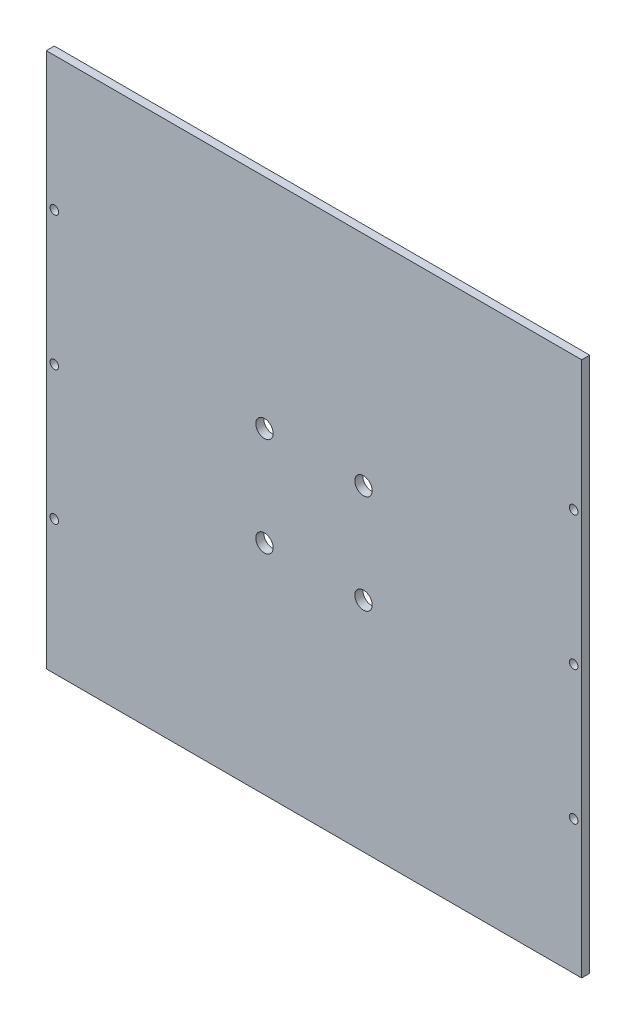
ISO-10303-21;
HEADER;
FILE_DESCRIPTION(('STEP AP214'),'2;1');
FILE_NAME('part.step','',(''),(''),'','','');
FILE_SCHEMA(('AUTOMOTIVE_DESIGN { 1 0 10303 214 1 1 1 1 }'));
ENDSEC;
DATA;
#1=APPLICATION_CONTEXT('core data for automotive mechanical design processes');
#2=APPLICATION_PROTOCOL_DEFINITION('international standard','automotive_design',2000,#1);
#3=PRODUCT_CONTEXT('',#1,'mechanical');
#4=PRODUCT('Part','Part','',(#3));
#5=PRODUCT_RELATED_PRODUCT_CATEGORY('part','',(#4));
#6=PRODUCT_DEFINITION_FORMATION('','',#4);
#7=PRODUCT_DEFINITION_CONTEXT('part definition',#1,'design');
#8=PRODUCT_DEFINITION('design','',#6,#7);
#9=PRODUCT_DEFINITION_SHAPE('','',#8);
#10=(LENGTH_UNIT() NAMED_UNIT(*) SI_UNIT(.MILLI.,.METRE.));
#11=(NAMED_UNIT(*) PLANE_ANGLE_UNIT() SI_UNIT($,.RADIAN.));
#12=(NAMED_UNIT(*) SI_UNIT($,.STERADIAN.) SOLID_ANGLE_UNIT());
#13=UNCERTAINTY_MEASURE_WITH_UNIT(LENGTH_MEASURE(1.E-05),#10,'distance_accuracy_value','');
#14=(GEOMETRIC_REPRESENTATION_CONTEXT(3) GLOBAL_UNCERTAINTY_ASSIGNED_CONTEXT((#13)) GLOBAL_UNIT_ASSIGNED_CONTEXT((#10,
#11,#12)) REPRESENTATION_CONTEXT('',''));
#15=CARTESIAN_POINT('',(0.,0.,0.));
#16=DIRECTION('',(0.,0.,1.));
#17=DIRECTION('',(1.,0.,0.));
#18=AXIS2_PLACEMENT_3D('',#15,#16,#17);
#19=CARTESIAN_POINT('',(0.,0.,3.));
#20=DIRECTION('',(0.,0.,1.));
#21=DIRECTION('',(1.,0.,0.));
#22=AXIS2_PLACEMENT_3D('',#19,#20,#21);
#23=PLANE('',#22);
#24=CARTESIAN_POINT('',(-97.,-50.,3.));
#25=DIRECTION('',(0.,0.,1.));
#26=DIRECTION('',(-1.,0.,0.));
#27=AXIS2_PLACEMENT_3D('',#24,#25,#26);
#28=CIRCLE('',#27,1.60000000000001);
#29=CARTESIAN_POINT('',(-98.6,-50.,3.));
#30=VERTEX_POINT('',#29);
#31=EDGE_CURVE('E196',#30,#30,#28,.T.);
#32=ORIENTED_EDGE('',*,*,#31,.F.);
#33=EDGE_LOOP('',(#32));
#34=FACE_BOUND('',#33,.T.);
#35=CARTESIAN_POINT('',(97.,-50.,3.));
#36=DIRECTION('',(0.,0.,1.));
#37=DIRECTION('',(1.,0.,0.));
#38=AXIS2_PLACEMENT_3D('',#35,#36,#37);
#39=CIRCLE('',#38,1.60000000000001);
#40=CARTESIAN_POINT('',(98.6,-50.,3.));
#41=VERTEX_POINT('',#40);
#42=EDGE_CURVE('E180',#41,#41,#39,.T.);
#43=ORIENTED_EDGE('',*,*,#42,.F.);
#44=EDGE_LOOP('',(#43));
#45=FACE_BOUND('',#44,.T.);
#46=CARTESIAN_POINT('',(-97.,0.,3.));
#47=DIRECTION('',(0.,0.,1.));
#48=DIRECTION('',(1.,0.,0.));
#49=AXIS2_PLACEMENT_3D('',#46,#47,#48);
#50=CIRCLE('',#49,1.60000000000001);
#51=CARTESIAN_POINT('',(-95.4,0.,3.));
#52=VERTEX_POINT('',#51);
#53=EDGE_CURVE('E164',#52,#52,#50,.T.);
#54=ORIENTED_EDGE('',*,*,#53,.F.);
#55=EDGE_LOOP('',(#54));
#56=FACE_BOUND('',#55,.T.);
#57=CARTESIAN_POINT('',(18.5,-18.5,3.));
#58=DIRECTION('',(0.,0.,1.));
#59=DIRECTION('',(1.,0.,0.));
#60=AXIS2_PLACEMENT_3D('',#57,#58,#59);
#61=CIRCLE('',#60,3.25);
#62=CARTESIAN_POINT('',(21.75,-18.5,3.));
#63=VERTEX_POINT('',#62);
#64=EDGE_CURVE('E148',#63,#63,#61,.T.);
#65=ORIENTED_EDGE('',*,*,#64,.F.);
#66=EDGE_LOOP('',(#65));
#67=FACE_BOUND('',#66,.T.);
#68=CARTESIAN_POINT('',(-18.5,18.5,3.));
#69=DIRECTION('',(0.,0.,1.));
#70=DIRECTION('',(1.,0.,0.));
#71=AXIS2_PLACEMENT_3D('',#68,#69,#70);
#72=CIRCLE('',#71,3.25);
#73=CARTESIAN_POINT('',(-15.25,18.5,3.));
#74=VERTEX_POINT('',#73);
#75=EDGE_CURVE('E118',#74,#74,#72,.T.);
#76=ORIENTED_EDGE('',*,*,#75,.F.);
#77=EDGE_LOOP('',(#76));
#78=FACE_BOUND('',#77,.T.);
#79=DIRECTION('',(0.,1.,0.));
#80=VECTOR('',#79,1.);
#81=CARTESIAN_POINT('',(100.,100.,3.));
#82=LINE('',#81,#80);
#83=CARTESIAN_POINT('',(100.,-100.,3.));
#84=VERTEX_POINT('',#83);
#85=CARTESIAN_POINT('',(100.,100.,3.));
#86=VERTEX_POINT('',#85);
#87=EDGE_CURVE('E98',#84,#86,#82,.T.);
#88=ORIENTED_EDGE('',*,*,#87,.T.);
#89=DIRECTION('',(-1.,0.,0.));
#90=VECTOR('',#89,1.);
#91=CARTESIAN_POINT('',(-100.,100.,3.));
#92=LINE('',#91,#90);
#93=CARTESIAN_POINT('',(-100.,100.,3.));
#94=VERTEX_POINT('',#93);
#95=EDGE_CURVE('E93',#86,#94,#92,.T.);
#96=ORIENTED_EDGE('',*,*,#95,.T.);
#97=DIRECTION('',(0.,-1.,0.));
#98=VECTOR('',#97,1.);
#99=CARTESIAN_POINT('',(-100.,100.,3.));
#100=LINE('',#99,#98);
#101=CARTESIAN_POINT('',(-100.,-100.,3.));
#102=VERTEX_POINT('',#101);
#103=EDGE_CURVE('E96',#94,#102,#100,.T.);
#104=ORIENTED_EDGE('',*,*,#103,.T.);
#105=DIRECTION('',(1.,0.,0.));
#106=VECTOR('',#105,1.);
#107=CARTESIAN_POINT('',(-100.,-100.,3.));
#108=LINE('',#107,#106);
#109=EDGE_CURVE('E63',#102,#84,#108,.T.);
#110=ORIENTED_EDGE('',*,*,#109,.T.);
#111=EDGE_LOOP('',(#88,#96,#104,#110));
#112=FACE_BOUND('',#111,.T.);
#113=CARTESIAN_POINT('',(18.5,18.5,3.));
#114=DIRECTION('',(0.,0.,1.));
#115=DIRECTION('',(-1.,0.,0.));
#116=AXIS2_PLACEMENT_3D('',#113,#114,#115);
#117=CIRCLE('',#116,3.25);
#118=CARTESIAN_POINT('',(15.25,18.5,3.));
#119=VERTEX_POINT('',#118);
#120=EDGE_CURVE('E140',#119,#119,#117,.T.);
#121=ORIENTED_EDGE('',*,*,#120,.F.);
#122=EDGE_LOOP('',(#121));
#123=FACE_BOUND('',#122,.T.);
#124=CARTESIAN_POINT('',(-18.5,-18.5,3.));
#125=DIRECTION('',(0.,0.,1.));
#126=DIRECTION('',(-1.,0.,0.));
#127=AXIS2_PLACEMENT_3D('',#124,#125,#126);
#128=CIRCLE('',#127,3.25);
#129=CARTESIAN_POINT('',(-21.75,-18.5,3.));
#130=VERTEX_POINT('',#129);
#131=EDGE_CURVE('E156',#130,#130,#128,.T.);
#132=ORIENTED_EDGE('',*,*,#131,.F.);
#133=EDGE_LOOP('',(#132));
#134=FACE_BOUND('',#133,.T.);
#135=CARTESIAN_POINT('',(97.,0.,3.));
#136=DIRECTION('',(0.,0.,1.));
#137=DIRECTION('',(1.,0.,0.));
#138=AXIS2_PLACEMENT_3D('',#135,#136,#137);
#139=CIRCLE('',#138,1.60000000000001);
#140=CARTESIAN_POINT('',(98.6,0.,3.));
#141=VERTEX_POINT('',#140);
#142=EDGE_CURVE('E172',#141,#141,#139,.T.);
#143=ORIENTED_EDGE('',*,*,#142,.F.);
#144=EDGE_LOOP('',(#143));
#145=FACE_BOUND('',#144,.T.);
#146=CARTESIAN_POINT('',(97.,50.,3.));
#147=DIRECTION('',(0.,0.,1.));
#148=DIRECTION('',(-1.,0.,0.));
#149=AXIS2_PLACEMENT_3D('',#146,#147,#148);
#150=CIRCLE('',#149,1.60000000000001);
#151=CARTESIAN_POINT('',(95.4,50.,3.));
#152=VERTEX_POINT('',#151);
#153=EDGE_CURVE('E188',#152,#152,#150,.T.);
#154=ORIENTED_EDGE('',*,*,#153,.F.);
#155=EDGE_LOOP('',(#154));
#156=FACE_BOUND('',#155,.T.);
#157=CARTESIAN_POINT('',(-97.,50.,3.));
#158=DIRECTION('',(0.,0.,1.));
#159=DIRECTION('',(1.,0.,0.));
#160=AXIS2_PLACEMENT_3D('',#157,#158,#159);
#161=CIRCLE('',#160,1.60000000000001);
#162=CARTESIAN_POINT('',(-95.4,50.,3.));
#163=VERTEX_POINT('',#162);
#164=EDGE_CURVE('E204',#163,#163,#161,.T.);
#165=ORIENTED_EDGE('',*,*,#164,.F.);
#166=EDGE_LOOP('',(#165));
#167=FACE_BOUND('',#166,.T.);
#168=ADVANCED_FACE('F45',(#34,#45,#56,#67,#78,#112,#123,#134,#145,#156,#167),#23,.T.);
#169=CARTESIAN_POINT('',(0.,0.,0.));
#170=DIRECTION('',(0.,0.,1.));
#171=DIRECTION('',(1.,0.,0.));
#172=AXIS2_PLACEMENT_3D('',#169,#170,#171);
#173=PLANE('',#172);
#174=DIRECTION('',(0.,1.,0.));
#175=VECTOR('',#174,1.);
#176=CARTESIAN_POINT('',(100.,100.,0.));
#177=LINE('',#176,#175);
#178=CARTESIAN_POINT('',(100.,-100.,0.));
#179=VERTEX_POINT('',#178);
#180=CARTESIAN_POINT('',(100.,100.,0.));
#181=VERTEX_POINT('',#180);
#182=EDGE_CURVE('E114',#179,#181,#177,.T.);
#183=ORIENTED_EDGE('',*,*,#182,.F.);
#184=DIRECTION('',(1.,0.,0.));
#185=VECTOR('',#184,1.);
#186=CARTESIAN_POINT('',(-100.,-100.,0.));
#187=LINE('',#186,#185);
#188=CARTESIAN_POINT('',(-100.,-100.,0.));
#189=VERTEX_POINT('',#188);
#190=EDGE_CURVE('E86',#189,#179,#187,.T.);
#191=ORIENTED_EDGE('',*,*,#190,.F.);
#192=DIRECTION('',(0.,-1.,0.));
#193=VECTOR('',#192,1.);
#194=CARTESIAN_POINT('',(-100.,100.,0.));
#195=LINE('',#194,#193);
#196=CARTESIAN_POINT('',(-100.,100.,0.));
#197=VERTEX_POINT('',#196);
#198=EDGE_CURVE('E80',#197,#189,#195,.T.);
#199=ORIENTED_EDGE('',*,*,#198,.F.);
#200=DIRECTION('',(-1.,0.,0.));
#201=VECTOR('',#200,1.);
#202=CARTESIAN_POINT('',(-100.,100.,0.));
#203=LINE('',#202,#201);
#204=EDGE_CURVE('E103',#181,#197,#203,.T.);
#205=ORIENTED_EDGE('',*,*,#204,.F.);
#206=EDGE_LOOP('',(#183,#191,#199,#205));
#207=FACE_BOUND('',#206,.T.);
#208=CARTESIAN_POINT('',(-18.5,18.5,0.));
#209=DIRECTION('',(0.,0.,1.));
#210=DIRECTION('',(1.,0.,0.));
#211=AXIS2_PLACEMENT_3D('',#208,#209,#210);
#212=CIRCLE('',#211,3.25);
#213=CARTESIAN_POINT('',(-15.25,18.5,0.));
#214=VERTEX_POINT('',#213);
#215=EDGE_CURVE('E136',#214,#214,#212,.T.);
#216=ORIENTED_EDGE('',*,*,#215,.T.);
#217=EDGE_LOOP('',(#216));
#218=FACE_BOUND('',#217,.T.);
#219=CARTESIAN_POINT('',(18.5,18.5,0.));
#220=DIRECTION('',(0.,0.,1.));
#221=DIRECTION('',(-1.,0.,0.));
#222=AXIS2_PLACEMENT_3D('',#219,#220,#221);
#223=CIRCLE('',#222,3.25);
#224=CARTESIAN_POINT('',(15.25,18.5,0.));
#225=VERTEX_POINT('',#224);
#226=EDGE_CURVE('E144',#225,#225,#223,.T.);
#227=ORIENTED_EDGE('',*,*,#226,.T.);
#228=EDGE_LOOP('',(#227));
#229=FACE_BOUND('',#228,.T.);
#230=CARTESIAN_POINT('',(18.5,-18.5,0.));
#231=DIRECTION('',(0.,0.,1.));
#232=DIRECTION('',(1.,0.,0.));
#233=AXIS2_PLACEMENT_3D('',#230,#231,#232);
#234=CIRCLE('',#233,3.25);
#235=CARTESIAN_POINT('',(21.75,-18.5,0.));
#236=VERTEX_POINT('',#235);
#237=EDGE_CURVE('E152',#236,#236,#234,.T.);
#238=ORIENTED_EDGE('',*,*,#237,.T.);
#239=EDGE_LOOP('',(#238));
#240=FACE_BOUND('',#239,.T.);
#241=CARTESIAN_POINT('',(-18.5,-18.5,0.));
#242=DIRECTION('',(0.,0.,1.));
#243=DIRECTION('',(-1.,0.,0.));
#244=AXIS2_PLACEMENT_3D('',#241,#242,#243);
#245=CIRCLE('',#244,3.25);
#246=CARTESIAN_POINT('',(-21.75,-18.5,0.));
#247=VERTEX_POINT('',#246);
#248=EDGE_CURVE('E160',#247,#247,#245,.T.);
#249=ORIENTED_EDGE('',*,*,#248,.T.);
#250=EDGE_LOOP('',(#249));
#251=FACE_BOUND('',#250,.T.);
#252=CARTESIAN_POINT('',(-97.,0.,0.));
#253=DIRECTION('',(0.,0.,1.));
#254=DIRECTION('',(1.,0.,0.));
#255=AXIS2_PLACEMENT_3D('',#252,#253,#254);
#256=CIRCLE('',#255,1.60000000000001);
#257=CARTESIAN_POINT('',(-95.4,0.,0.));
#258=VERTEX_POINT('',#257);
#259=EDGE_CURVE('E168',#258,#258,#256,.T.);
#260=ORIENTED_EDGE('',*,*,#259,.T.);
#261=EDGE_LOOP('',(#260));
#262=FACE_BOUND('',#261,.T.);
#263=CARTESIAN_POINT('',(97.,0.,0.));
#264=DIRECTION('',(0.,0.,1.));
#265=DIRECTION('',(1.,0.,0.));
#266=AXIS2_PLACEMENT_3D('',#263,#264,#265);
#267=CIRCLE('',#266,1.60000000000001);
#268=CARTESIAN_POINT('',(98.6,0.,0.));
#269=VERTEX_POINT('',#268);
#270=EDGE_CURVE('E176',#269,#269,#267,.T.);
#271=ORIENTED_EDGE('',*,*,#270,.T.);
#272=EDGE_LOOP('',(#271));
#273=FACE_BOUND('',#272,.T.);
#274=CARTESIAN_POINT('',(97.,-50.,0.));
#275=DIRECTION('',(0.,0.,1.));
#276=DIRECTION('',(1.,0.,0.));
#277=AXIS2_PLACEMENT_3D('',#274,#275,#276);
#278=CIRCLE('',#277,1.60000000000001);
#279=CARTESIAN_POINT('',(98.6,-50.,0.));
#280=VERTEX_POINT('',#279);
#281=EDGE_CURVE('E184',#280,#280,#278,.T.);
#282=ORIENTED_EDGE('',*,*,#281,.T.);
#283=EDGE_LOOP('',(#282));
#284=FACE_BOUND('',#283,.T.);
#285=CARTESIAN_POINT('',(97.,50.,0.));
#286=DIRECTION('',(0.,0.,1.));
#287=DIRECTION('',(-1.,0.,0.));
#288=AXIS2_PLACEMENT_3D('',#285,#286,#287);
#289=CIRCLE('',#288,1.60000000000001);
#290=CARTESIAN_POINT('',(95.4,50.,0.));
#291=VERTEX_POINT('',#290);
#292=EDGE_CURVE('E192',#291,#291,#289,.T.);
#293=ORIENTED_EDGE('',*,*,#292,.T.);
#294=EDGE_LOOP('',(#293));
#295=FACE_BOUND('',#294,.T.);
#296=CARTESIAN_POINT('',(-97.,-50.,0.));
#297=DIRECTION('',(0.,0.,1.));
#298=DIRECTION('',(-1.,0.,0.));
#299=AXIS2_PLACEMENT_3D('',#296,#297,#298);
#300=CIRCLE('',#299,1.60000000000001);
#301=CARTESIAN_POINT('',(-98.6,-50.,0.));
#302=VERTEX_POINT('',#301);
#303=EDGE_CURVE('E200',#302,#302,#300,.T.);
#304=ORIENTED_EDGE('',*,*,#303,.T.);
#305=EDGE_LOOP('',(#304));
#306=FACE_BOUND('',#305,.T.);
#307=CARTESIAN_POINT('',(-97.,50.,0.));
#308=DIRECTION('',(0.,0.,1.));
#309=DIRECTION('',(1.,0.,0.));
#310=AXIS2_PLACEMENT_3D('',#307,#308,#309);
#311=CIRCLE('',#310,1.60000000000001);
#312=CARTESIAN_POINT('',(-95.4,50.,0.));
#313=VERTEX_POINT('',#312);
#314=EDGE_CURVE('E208',#313,#313,#311,.T.);
#315=ORIENTED_EDGE('',*,*,#314,.T.);
#316=EDGE_LOOP('',(#315));
#317=FACE_BOUND('',#316,.T.);
#318=ADVANCED_FACE('F131',(#207,#218,#229,#240,#251,#262,#273,#284,#295,#306,#317),#173,.F.);
#319=CARTESIAN_POINT('',(100.,100.,3.));
#320=DIRECTION('',(-1.,0.,0.));
#321=DIRECTION('',(0.,0.,1.));
#322=AXIS2_PLACEMENT_3D('',#319,#320,#321);
#323=PLANE('',#322);
#324=ORIENTED_EDGE('',*,*,#182,.T.);
#325=DIRECTION('',(0.,0.,-1.));
#326=VECTOR('',#325,1.);
#327=CARTESIAN_POINT('',(100.,100.,3.));
#328=LINE('',#327,#326);
#329=EDGE_CURVE('E11',#86,#181,#328,.T.);
#330=ORIENTED_EDGE('',*,*,#329,.F.);
#331=ORIENTED_EDGE('',*,*,#87,.F.);
#332=DIRECTION('',(0.,0.,-1.));
#333=VECTOR('',#332,1.);
#334=CARTESIAN_POINT('',(100.,-100.,3.));
#335=LINE('',#334,#333);
#336=EDGE_CURVE('E110',#84,#179,#335,.T.);
#337=ORIENTED_EDGE('',*,*,#336,.T.);
#338=EDGE_LOOP('',(#324,#330,#331,#337));
#339=FACE_BOUND('',#338,.T.);
#340=ADVANCED_FACE('F47',(#339),#323,.F.);
#341=CARTESIAN_POINT('',(-100.,100.,3.));
#342=DIRECTION('',(0.,-1.,0.));
#343=DIRECTION('',(0.,0.,-1.));
#344=AXIS2_PLACEMENT_3D('',#341,#342,#343);
#345=PLANE('',#344);
#346=ORIENTED_EDGE('',*,*,#204,.T.);
#347=DIRECTION('',(0.,0.,-1.));
#348=VECTOR('',#347,1.);
#349=CARTESIAN_POINT('',(-100.,100.,3.));
#350=LINE('',#349,#348);
#351=EDGE_CURVE('E55',#94,#197,#350,.T.);
#352=ORIENTED_EDGE('',*,*,#351,.F.);
#353=ORIENTED_EDGE('',*,*,#95,.F.);
#354=ORIENTED_EDGE('',*,*,#329,.T.);
#355=EDGE_LOOP('',(#346,#352,#353,#354));
#356=FACE_BOUND('',#355,.T.);
#357=ADVANCED_FACE('F102',(#356),#345,.F.);
#358=CARTESIAN_POINT('',(-100.,100.,3.));
#359=DIRECTION('',(1.,0.,0.));
#360=DIRECTION('',(0.,0.,-1.));
#361=AXIS2_PLACEMENT_3D('',#358,#359,#360);
#362=PLANE('',#361);
#363=ORIENTED_EDGE('',*,*,#198,.T.);
#364=DIRECTION('',(0.,0.,-1.));
#365=VECTOR('',#364,1.);
#366=CARTESIAN_POINT('',(-100.,-100.,3.));
#367=LINE('',#366,#365);
#368=EDGE_CURVE('E105',#102,#189,#367,.T.);
#369=ORIENTED_EDGE('',*,*,#368,.F.);
#370=ORIENTED_EDGE('',*,*,#103,.F.);
#371=ORIENTED_EDGE('',*,*,#351,.T.);
#372=EDGE_LOOP('',(#363,#369,#370,#371));
#373=FACE_BOUND('',#372,.T.);
#374=ADVANCED_FACE('F106',(#373),#362,.F.);
#375=CARTESIAN_POINT('',(-100.,-100.,3.));
#376=DIRECTION('',(0.,1.,0.));
#377=DIRECTION('',(0.,0.,1.));
#378=AXIS2_PLACEMENT_3D('',#375,#376,#377);
#379=PLANE('',#378);
#380=ORIENTED_EDGE('',*,*,#190,.T.);
#381=ORIENTED_EDGE('',*,*,#336,.F.);
#382=ORIENTED_EDGE('',*,*,#109,.F.);
#383=ORIENTED_EDGE('',*,*,#368,.T.);
#384=EDGE_LOOP('',(#380,#381,#382,#383));
#385=FACE_BOUND('',#384,.T.);
#386=ADVANCED_FACE('F128',(#385),#379,.F.);
#387=CARTESIAN_POINT('',(-18.5,18.5,3.));
#388=DIRECTION('',(0.,0.,-1.));
#389=DIRECTION('',(-1.,0.,0.));
#390=AXIS2_PLACEMENT_3D('',#387,#388,#389);
#391=CYLINDRICAL_SURFACE('',#390,3.25);
#392=ORIENTED_EDGE('',*,*,#75,.T.);
#393=EDGE_LOOP('',(#392));
#394=FACE_BOUND('',#393,.T.);
#395=ORIENTED_EDGE('',*,*,#215,.F.);
#396=EDGE_LOOP('',(#395));
#397=FACE_BOUND('',#396,.T.);
#398=ADVANCED_FACE('F229',(#394,#397),#391,.F.);
#399=CARTESIAN_POINT('',(18.5,18.5,3.));
#400=DIRECTION('',(0.,0.,-1.));
#401=DIRECTION('',(-1.,0.,0.));
#402=AXIS2_PLACEMENT_3D('',#399,#400,#401);
#403=CYLINDRICAL_SURFACE('',#402,3.25);
#404=ORIENTED_EDGE('',*,*,#120,.T.);
#405=EDGE_LOOP('',(#404));
#406=FACE_BOUND('',#405,.T.);
#407=ORIENTED_EDGE('',*,*,#226,.F.);
#408=EDGE_LOOP('',(#407));
#409=FACE_BOUND('',#408,.T.);
#410=ADVANCED_FACE('F274',(#406,#409),#403,.F.);
#411=CARTESIAN_POINT('',(18.5,-18.5,3.));
#412=DIRECTION('',(0.,0.,-1.));
#413=DIRECTION('',(-1.,0.,0.));
#414=AXIS2_PLACEMENT_3D('',#411,#412,#413);
#415=CYLINDRICAL_SURFACE('',#414,3.25);
#416=ORIENTED_EDGE('',*,*,#64,.T.);
#417=EDGE_LOOP('',(#416));
#418=FACE_BOUND('',#417,.T.);
#419=ORIENTED_EDGE('',*,*,#237,.F.);
#420=EDGE_LOOP('',(#419));
#421=FACE_BOUND('',#420,.T.);
#422=ADVANCED_FACE('F282',(#418,#421),#415,.F.);
#423=CARTESIAN_POINT('',(-18.5,-18.5,3.));
#424=DIRECTION('',(0.,0.,-1.));
#425=DIRECTION('',(-1.,0.,0.));
#426=AXIS2_PLACEMENT_3D('',#423,#424,#425);
#427=CYLINDRICAL_SURFACE('',#426,3.25);
#428=ORIENTED_EDGE('',*,*,#131,.T.);
#429=EDGE_LOOP('',(#428));
#430=FACE_BOUND('',#429,.T.);
#431=ORIENTED_EDGE('',*,*,#248,.F.);
#432=EDGE_LOOP('',(#431));
#433=FACE_BOUND('',#432,.T.);
#434=ADVANCED_FACE('F290',(#430,#433),#427,.F.);
#435=CARTESIAN_POINT('',(-97.,0.,3.));
#436=DIRECTION('',(0.,0.,-1.));
#437=DIRECTION('',(-1.,0.,0.));
#438=AXIS2_PLACEMENT_3D('',#435,#436,#437);
#439=CYLINDRICAL_SURFACE('',#438,1.60000000000001);
#440=ORIENTED_EDGE('',*,*,#53,.T.);
#441=EDGE_LOOP('',(#440));
#442=FACE_BOUND('',#441,.T.);
#443=ORIENTED_EDGE('',*,*,#259,.F.);
#444=EDGE_LOOP('',(#443));
#445=FACE_BOUND('',#444,.T.);
#446=ADVANCED_FACE('F299',(#442,#445),#439,.F.);
#447=CARTESIAN_POINT('',(97.,0.,3.));
#448=DIRECTION('',(0.,0.,-1.));
#449=DIRECTION('',(-1.,0.,0.));
#450=AXIS2_PLACEMENT_3D('',#447,#448,#449);
#451=CYLINDRICAL_SURFACE('',#450,1.60000000000001);
#452=ORIENTED_EDGE('',*,*,#142,.T.);
#453=EDGE_LOOP('',(#452));
#454=FACE_BOUND('',#453,.T.);
#455=ORIENTED_EDGE('',*,*,#270,.F.);
#456=EDGE_LOOP('',(#455));
#457=FACE_BOUND('',#456,.T.);
#458=ADVANCED_FACE('F308',(#454,#457),#451,.F.);
#459=CARTESIAN_POINT('',(97.,-50.,3.));
#460=DIRECTION('',(0.,0.,-1.));
#461=DIRECTION('',(-1.,0.,0.));
#462=AXIS2_PLACEMENT_3D('',#459,#460,#461);
#463=CYLINDRICAL_SURFACE('',#462,1.60000000000001);
#464=ORIENTED_EDGE('',*,*,#42,.T.);
#465=EDGE_LOOP('',(#464));
#466=FACE_BOUND('',#465,.T.);
#467=ORIENTED_EDGE('',*,*,#281,.F.);
#468=EDGE_LOOP('',(#467));
#469=FACE_BOUND('',#468,.T.);
#470=ADVANCED_FACE('F317',(#466,#469),#463,.F.);
#471=CARTESIAN_POINT('',(97.,50.,3.));
#472=DIRECTION('',(0.,0.,-1.));
#473=DIRECTION('',(-1.,0.,0.));
#474=AXIS2_PLACEMENT_3D('',#471,#472,#473);
#475=CYLINDRICAL_SURFACE('',#474,1.60000000000001);
#476=ORIENTED_EDGE('',*,*,#153,.T.);
#477=EDGE_LOOP('',(#476));
#478=FACE_BOUND('',#477,.T.);
#479=ORIENTED_EDGE('',*,*,#292,.F.);
#480=EDGE_LOOP('',(#479));
#481=FACE_BOUND('',#480,.T.);
#482=ADVANCED_FACE('F326',(#478,#481),#475,.F.);
#483=CARTESIAN_POINT('',(-97.,-50.,3.));
#484=DIRECTION('',(0.,0.,-1.));
#485=DIRECTION('',(-1.,0.,0.));
#486=AXIS2_PLACEMENT_3D('',#483,#484,#485);
#487=CYLINDRICAL_SURFACE('',#486,1.60000000000001);
#488=ORIENTED_EDGE('',*,*,#31,.T.);
#489=EDGE_LOOP('',(#488));
#490=FACE_BOUND('',#489,.T.);
#491=ORIENTED_EDGE('',*,*,#303,.F.);
#492=EDGE_LOOP('',(#491));
#493=FACE_BOUND('',#492,.T.);
#494=ADVANCED_FACE('F335',(#490,#493),#487,.F.);
#495=CARTESIAN_POINT('',(-97.,50.,3.));
#496=DIRECTION('',(0.,0.,-1.));
#497=DIRECTION('',(-1.,0.,0.));
#498=AXIS2_PLACEMENT_3D('',#495,#496,#497);
#499=CYLINDRICAL_SURFACE('',#498,1.60000000000001);
#500=ORIENTED_EDGE('',*,*,#164,.T.);
#501=EDGE_LOOP('',(#500));
#502=FACE_BOUND('',#501,.T.);
#503=ORIENTED_EDGE('',*,*,#314,.F.);
#504=EDGE_LOOP('',(#503));
#505=FACE_BOUND('',#504,.T.);
#506=ADVANCED_FACE('F216',(#502,#505),#499,.F.);
#507=CLOSED_SHELL('',(#168,#318,#340,#357,#374,#386,#398,#410,#422,#434,#446,#458,#470,#482,
#494,#506));
#508=MANIFOLD_SOLID_BREP('B2',#507);
#509=ADVANCED_BREP_SHAPE_REPRESENTATION('',(#18,#508),#14);
#510=SHAPE_DEFINITION_REPRESENTATION(#9,#509);
ENDSEC;
END-ISO-10303-21;
